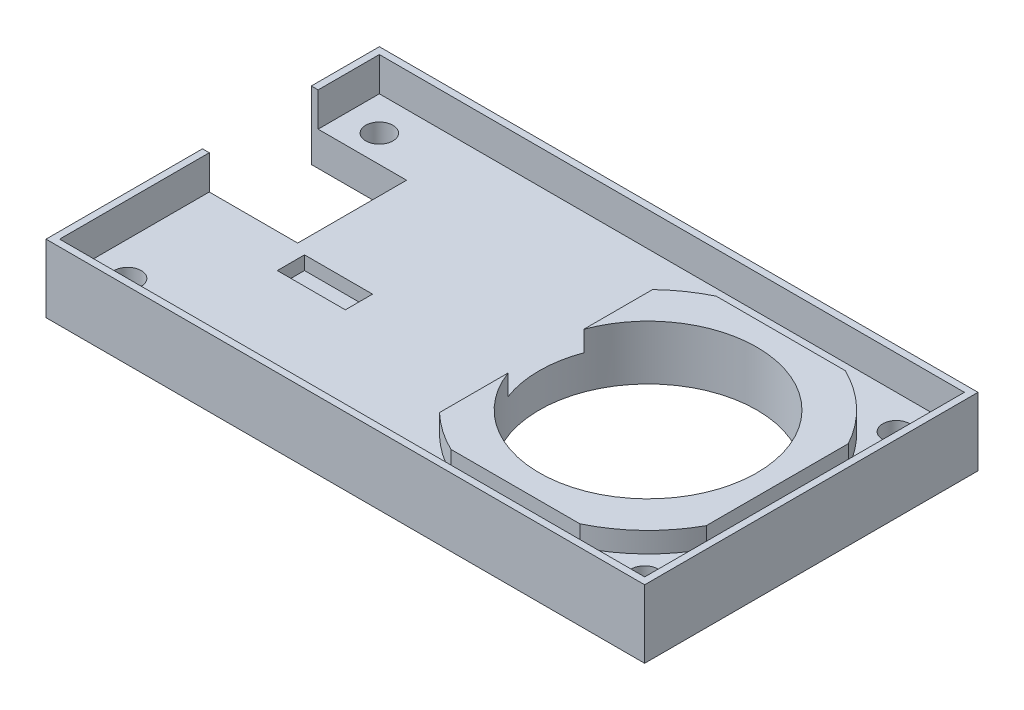
ISO-10303-21;
HEADER;
FILE_DESCRIPTION(('STEP AP214'),'2;1');
FILE_NAME('part.step','',(''),(''),'','','');
FILE_SCHEMA(('AUTOMOTIVE_DESIGN { 1 0 10303 214 1 1 1 1 }'));
ENDSEC;
DATA;
#1=APPLICATION_CONTEXT('core data for automotive mechanical design processes');
#2=APPLICATION_PROTOCOL_DEFINITION('international standard','automotive_design',2000,#1);
#3=PRODUCT_CONTEXT('',#1,'mechanical');
#4=PRODUCT('Part','Part','',(#3));
#5=PRODUCT_RELATED_PRODUCT_CATEGORY('part','',(#4));
#6=PRODUCT_DEFINITION_FORMATION('','',#4);
#7=PRODUCT_DEFINITION_CONTEXT('part definition',#1,'design');
#8=PRODUCT_DEFINITION('design','',#6,#7);
#9=PRODUCT_DEFINITION_SHAPE('','',#8);
#10=(LENGTH_UNIT() NAMED_UNIT(*) SI_UNIT(.MILLI.,.METRE.));
#11=(NAMED_UNIT(*) PLANE_ANGLE_UNIT() SI_UNIT($,.RADIAN.));
#12=(NAMED_UNIT(*) SI_UNIT($,.STERADIAN.) SOLID_ANGLE_UNIT());
#13=UNCERTAINTY_MEASURE_WITH_UNIT(LENGTH_MEASURE(1.E-05),#10,'distance_accuracy_value','');
#14=(GEOMETRIC_REPRESENTATION_CONTEXT(3) GLOBAL_UNCERTAINTY_ASSIGNED_CONTEXT((#13)) GLOBAL_UNIT_ASSIGNED_CONTEXT((#10,
#11,#12)) REPRESENTATION_CONTEXT('',''));
#15=CARTESIAN_POINT('',(0.,0.,0.));
#16=DIRECTION('',(0.,0.,1.));
#17=DIRECTION('',(1.,0.,0.));
#18=AXIS2_PLACEMENT_3D('',#15,#16,#17);
#19=CARTESIAN_POINT('',(64.,8.,-24.5));
#20=DIRECTION('',(0.,-1.,0.));
#21=DIRECTION('',(0.,0.,-1.));
#22=AXIS2_PLACEMENT_3D('',#19,#20,#21);
#23=CYLINDRICAL_SURFACE('',#22,21.6822351075379);
#24=CARTESIAN_POINT('',(64.,8.,-24.5));
#25=DIRECTION('',(0.,1.,0.));
#26=DIRECTION('',(0.,0.,1.));
#27=AXIS2_PLACEMENT_3D('',#24,#25,#26);
#28=CIRCLE('',#27,21.6822351075379);
#29=CARTESIAN_POINT('',(73.4799429986972,8.,-5.));
#30=VERTEX_POINT('',#29);
#31=CARTESIAN_POINT('',(83.,8.,-14.0539806979621));
#32=VERTEX_POINT('',#31);
#33=EDGE_CURVE('E394',#30,#32,#28,.T.);
#34=ORIENTED_EDGE('',*,*,#33,.F.);
#35=DIRECTION('',(0.,-1.,0.));
#36=VECTOR('',#35,1.);
#37=CARTESIAN_POINT('',(73.4799429986972,8.,-5.));
#38=LINE('',#37,#36);
#39=CARTESIAN_POINT('',(73.4799429986972,5.,-5.));
#40=VERTEX_POINT('',#39);
#41=EDGE_CURVE('E11',#30,#40,#38,.T.);
#42=ORIENTED_EDGE('',*,*,#41,.T.);
#43=CARTESIAN_POINT('',(64.,5.,-24.5));
#44=DIRECTION('',(0.,-1.,0.));
#45=DIRECTION('',(0.,0.,-1.));
#46=AXIS2_PLACEMENT_3D('',#43,#44,#45);
#47=CIRCLE('',#46,21.6822351075379);
#48=CARTESIAN_POINT('',(83.,5.,-14.0539806979621));
#49=VERTEX_POINT('',#48);
#50=EDGE_CURVE('E236',#40,#49,#47,.F.);
#51=ORIENTED_EDGE('',*,*,#50,.T.);
#52=DIRECTION('',(0.,-1.,0.));
#53=VECTOR('',#52,1.);
#54=CARTESIAN_POINT('',(83.,8.,-14.0539806979621));
#55=LINE('',#54,#53);
#56=EDGE_CURVE('E454',#49,#32,#55,.F.);
#57=ORIENTED_EDGE('',*,*,#56,.T.);
#58=EDGE_LOOP('',(#34,#42,#51,#57));
#59=FACE_BOUND('',#58,.T.);
#60=ADVANCED_FACE('F33',(#59),#23,.T.);
#61=CARTESIAN_POINT('',(54.5200570013027,8.,-44.));
#62=VERTEX_POINT('',#61);
#63=CARTESIAN_POINT('',(49.,8.,-40.1562868924451));
#64=VERTEX_POINT('',#63);
#65=EDGE_CURVE('E395',#62,#64,#28,.T.);
#66=ORIENTED_EDGE('',*,*,#65,.F.);
#67=DIRECTION('',(0.,-1.,0.));
#68=VECTOR('',#67,1.);
#69=CARTESIAN_POINT('',(54.5200570013027,8.,-44.));
#70=LINE('',#69,#68);
#71=CARTESIAN_POINT('',(54.5200570013027,5.,-44.));
#72=VERTEX_POINT('',#71);
#73=EDGE_CURVE('E226',#62,#72,#70,.T.);
#74=ORIENTED_EDGE('',*,*,#73,.T.);
#75=CARTESIAN_POINT('',(49.,5.,-40.1562868924451));
#76=VERTEX_POINT('',#75);
#77=EDGE_CURVE('E243',#72,#76,#47,.F.);
#78=ORIENTED_EDGE('',*,*,#77,.T.);
#79=DIRECTION('',(0.,-1.,0.));
#80=VECTOR('',#79,1.);
#81=CARTESIAN_POINT('',(49.,8.,-40.1562868924451));
#82=LINE('',#81,#80);
#83=EDGE_CURVE('E244',#64,#76,#82,.T.);
#84=ORIENTED_EDGE('',*,*,#83,.F.);
#85=EDGE_LOOP('',(#66,#74,#78,#84));
#86=FACE_BOUND('',#85,.T.);
#87=ADVANCED_FACE('F449',(#86),#23,.T.);
#88=CARTESIAN_POINT('',(83.,5.,-34.9460193020379));
#89=VERTEX_POINT('',#88);
#90=CARTESIAN_POINT('',(73.4799429986973,5.,-44.));
#91=VERTEX_POINT('',#90);
#92=EDGE_CURVE('E246',#89,#91,#47,.F.);
#93=ORIENTED_EDGE('',*,*,#92,.T.);
#94=DIRECTION('',(0.,-1.,0.));
#95=VECTOR('',#94,1.);
#96=CARTESIAN_POINT('',(73.4799429986973,8.,-44.));
#97=LINE('',#96,#95);
#98=CARTESIAN_POINT('',(73.4799429986973,8.,-44.));
#99=VERTEX_POINT('',#98);
#100=EDGE_CURVE('E458',#91,#99,#97,.F.);
#101=ORIENTED_EDGE('',*,*,#100,.T.);
#102=CARTESIAN_POINT('',(83.,8.,-34.9460193020379));
#103=VERTEX_POINT('',#102);
#104=EDGE_CURVE('E448',#103,#99,#28,.T.);
#105=ORIENTED_EDGE('',*,*,#104,.F.);
#106=DIRECTION('',(0.,-1.,0.));
#107=VECTOR('',#106,1.);
#108=CARTESIAN_POINT('',(83.,8.,-34.9460193020379));
#109=LINE('',#108,#107);
#110=EDGE_CURVE('E455',#103,#89,#109,.T.);
#111=ORIENTED_EDGE('',*,*,#110,.T.);
#112=EDGE_LOOP('',(#93,#101,#105,#111));
#113=FACE_BOUND('',#112,.T.);
#114=ADVANCED_FACE('F464',(#113),#23,.T.);
#115=CARTESIAN_POINT('',(0.,5.,0.));
#116=DIRECTION('',(0.,-1.,0.));
#117=DIRECTION('',(0.,0.,-1.));
#118=AXIS2_PLACEMENT_3D('',#115,#116,#117);
#119=PLANE('',#118);
#120=DIRECTION('',(1.,0.,0.));
#121=VECTOR('',#120,1.);
#122=CARTESIAN_POINT('',(83.,5.,-5.));
#123=LINE('',#122,#121);
#124=CARTESIAN_POINT('',(54.5200570013028,5.,-5.));
#125=VERTEX_POINT('',#124);
#126=EDGE_CURVE('E219',#125,#40,#123,.T.);
#127=ORIENTED_EDGE('',*,*,#126,.F.);
#128=CARTESIAN_POINT('',(49.,5.,-8.84371310755488));
#129=VERTEX_POINT('',#128);
#130=EDGE_CURVE('E233',#129,#125,#47,.F.);
#131=ORIENTED_EDGE('',*,*,#130,.F.);
#132=DIRECTION('',(0.,0.,-1.));
#133=VECTOR('',#132,1.);
#134=CARTESIAN_POINT('',(49.,5.,-7.54407288935077));
#135=LINE('',#134,#133);
#136=CARTESIAN_POINT('',(49.,5.,-18.93223563717));
#137=VERTEX_POINT('',#136);
#138=EDGE_CURVE('E409',#129,#137,#135,.T.);
#139=ORIENTED_EDGE('',*,*,#138,.T.);
#140=CARTESIAN_POINT('',(64.,5.,-24.5));
#141=DIRECTION('',(0.,-1.,0.));
#142=DIRECTION('',(0.,0.,-1.));
#143=AXIS2_PLACEMENT_3D('',#140,#141,#142);
#144=CIRCLE('',#143,16.);
#145=CARTESIAN_POINT('',(49.,5.,-30.06776436283));
#146=VERTEX_POINT('',#145);
#147=EDGE_CURVE('E404',#146,#137,#144,.F.);
#148=ORIENTED_EDGE('',*,*,#147,.F.);
#149=EDGE_CURVE('E407',#146,#76,#135,.T.);
#150=ORIENTED_EDGE('',*,*,#149,.T.);
#151=ORIENTED_EDGE('',*,*,#77,.F.);
#152=DIRECTION('',(-1.,0.,0.));
#153=VECTOR('',#152,1.);
#154=CARTESIAN_POINT('',(83.,5.,-44.));
#155=LINE('',#154,#153);
#156=EDGE_CURVE('E237',#91,#72,#155,.T.);
#157=ORIENTED_EDGE('',*,*,#156,.F.);
#158=ORIENTED_EDGE('',*,*,#92,.F.);
#159=DIRECTION('',(0.,0.,-1.));
#160=VECTOR('',#159,1.);
#161=CARTESIAN_POINT('',(83.,5.,-44.));
#162=LINE('',#161,#160);
#163=EDGE_CURVE('E439',#49,#89,#162,.T.);
#164=ORIENTED_EDGE('',*,*,#163,.F.);
#165=ORIENTED_EDGE('',*,*,#50,.F.);
#166=EDGE_LOOP('',(#127,#131,#139,#148,#150,#151,#157,#158,#164,#165));
#167=FACE_BOUND('',#166,.T.);
#168=CARTESIAN_POINT('',(82.,5.,-5.99999999999999));
#169=DIRECTION('',(0.,-1.,0.));
#170=DIRECTION('',(0.,0.,-1.));
#171=AXIS2_PLACEMENT_3D('',#168,#169,#170);
#172=CIRCLE('',#171,2.);
#173=CARTESIAN_POINT('',(82.,5.,-7.99999999999998));
#174=VERTEX_POINT('',#173);
#175=EDGE_CURVE('E430',#174,#174,#172,.F.);
#176=ORIENTED_EDGE('',*,*,#175,.F.);
#177=EDGE_LOOP('',(#176));
#178=FACE_BOUND('',#177,.T.);
#179=CARTESIAN_POINT('',(82.,5.,-43.));
#180=DIRECTION('',(0.,-1.,0.));
#181=DIRECTION('',(0.,0.,-1.));
#182=AXIS2_PLACEMENT_3D('',#179,#180,#181);
#183=CIRCLE('',#182,2.);
#184=CARTESIAN_POINT('',(82.,5.,-45.));
#185=VERTEX_POINT('',#184);
#186=EDGE_CURVE('E410',#185,#185,#183,.T.);
#187=ORIENTED_EDGE('',*,*,#186,.T.);
#188=EDGE_LOOP('',(#187));
#189=FACE_BOUND('',#188,.T.);
#190=DIRECTION('',(-1.,0.,0.));
#191=VECTOR('',#190,1.);
#192=CARTESIAN_POINT('',(1.,5.,-48.));
#193=LINE('',#192,#191);
#194=CARTESIAN_POINT('',(87.,5.,-48.));
#195=VERTEX_POINT('',#194);
#196=CARTESIAN_POINT('',(1.,5.,-48.));
#197=VERTEX_POINT('',#196);
#198=EDGE_CURVE('E312',#195,#197,#193,.T.);
#199=ORIENTED_EDGE('',*,*,#198,.T.);
#200=DIRECTION('',(0.,0.,1.));
#201=VECTOR('',#200,1.);
#202=CARTESIAN_POINT('',(1.,5.,-1.));
#203=LINE('',#202,#201);
#204=CARTESIAN_POINT('',(1.,5.,-39.));
#205=VERTEX_POINT('',#204);
#206=EDGE_CURVE('E320',#197,#205,#203,.T.);
#207=ORIENTED_EDGE('',*,*,#206,.T.);
#208=DIRECTION('',(1.,0.,0.));
#209=VECTOR('',#208,1.);
#210=CARTESIAN_POINT('',(0.,5.,-39.));
#211=LINE('',#210,#209);
#212=CARTESIAN_POINT('',(14.,5.,-39.));
#213=VERTEX_POINT('',#212);
#214=EDGE_CURVE('E248',#205,#213,#211,.T.);
#215=ORIENTED_EDGE('',*,*,#214,.T.);
#216=DIRECTION('',(0.,0.,1.));
#217=VECTOR('',#216,1.);
#218=CARTESIAN_POINT('',(14.,5.,0.));
#219=LINE('',#218,#217);
#220=CARTESIAN_POINT('',(14.,5.,-23.));
#221=VERTEX_POINT('',#220);
#222=EDGE_CURVE('E256',#213,#221,#219,.T.);
#223=ORIENTED_EDGE('',*,*,#222,.T.);
#224=DIRECTION('',(-1.,0.,0.));
#225=VECTOR('',#224,1.);
#226=CARTESIAN_POINT('',(0.,5.,-23.));
#227=LINE('',#226,#225);
#228=CARTESIAN_POINT('',(1.,5.,-23.));
#229=VERTEX_POINT('',#228);
#230=EDGE_CURVE('E260',#221,#229,#227,.T.);
#231=ORIENTED_EDGE('',*,*,#230,.T.);
#232=CARTESIAN_POINT('',(1.,5.,-1.));
#233=VERTEX_POINT('',#232);
#234=EDGE_CURVE('E322',#229,#233,#203,.T.);
#235=ORIENTED_EDGE('',*,*,#234,.T.);
#236=DIRECTION('',(1.,0.,0.));
#237=VECTOR('',#236,1.);
#238=CARTESIAN_POINT('',(1.,5.,-1.));
#239=LINE('',#238,#237);
#240=CARTESIAN_POINT('',(87.,5.,-1.));
#241=VERTEX_POINT('',#240);
#242=EDGE_CURVE('E318',#233,#241,#239,.T.);
#243=ORIENTED_EDGE('',*,*,#242,.T.);
#244=DIRECTION('',(0.,0.,-1.));
#245=VECTOR('',#244,1.);
#246=CARTESIAN_POINT('',(87.,5.,-1.));
#247=LINE('',#246,#245);
#248=EDGE_CURVE('E315',#241,#195,#247,.T.);
#249=ORIENTED_EDGE('',*,*,#248,.T.);
#250=EDGE_LOOP('',(#199,#207,#215,#223,#231,#235,#243,#249));
#251=FACE_BOUND('',#250,.T.);
#252=DIRECTION('',(-1.,0.,0.));
#253=VECTOR('',#252,1.);
#254=CARTESIAN_POINT('',(26.,5.,-22.));
#255=LINE('',#254,#253);
#256=CARTESIAN_POINT('',(26.,5.,-22.));
#257=VERTEX_POINT('',#256);
#258=CARTESIAN_POINT('',(16.,5.,-22.));
#259=VERTEX_POINT('',#258);
#260=EDGE_CURVE('E377',#257,#259,#255,.T.);
#261=ORIENTED_EDGE('',*,*,#260,.F.);
#262=DIRECTION('',(0.,0.,-1.));
#263=VECTOR('',#262,1.);
#264=CARTESIAN_POINT('',(26.,5.,-22.));
#265=LINE('',#264,#263);
#266=CARTESIAN_POINT('',(26.,5.,-18.));
#267=VERTEX_POINT('',#266);
#268=EDGE_CURVE('E380',#267,#257,#265,.T.);
#269=ORIENTED_EDGE('',*,*,#268,.F.);
#270=DIRECTION('',(1.,0.,0.));
#271=VECTOR('',#270,1.);
#272=CARTESIAN_POINT('',(26.,5.,-18.));
#273=LINE('',#272,#271);
#274=CARTESIAN_POINT('',(16.,5.,-18.));
#275=VERTEX_POINT('',#274);
#276=EDGE_CURVE('E370',#275,#267,#273,.T.);
#277=ORIENTED_EDGE('',*,*,#276,.F.);
#278=DIRECTION('',(0.,0.,1.));
#279=VECTOR('',#278,1.);
#280=CARTESIAN_POINT('',(16.,5.,-22.));
#281=LINE('',#280,#279);
#282=EDGE_CURVE('E374',#259,#275,#281,.T.);
#283=ORIENTED_EDGE('',*,*,#282,.F.);
#284=EDGE_LOOP('',(#261,#269,#277,#283));
#285=FACE_BOUND('',#284,.T.);
#286=CARTESIAN_POINT('',(6.00000000000001,5.,-6.));
#287=DIRECTION('',(0.,-1.,0.));
#288=DIRECTION('',(0.,0.,-1.));
#289=AXIS2_PLACEMENT_3D('',#286,#287,#288);
#290=CIRCLE('',#289,2.);
#291=CARTESIAN_POINT('',(6.00000000000001,5.,-8.));
#292=VERTEX_POINT('',#291);
#293=EDGE_CURVE('E424',#292,#292,#290,.T.);
#294=ORIENTED_EDGE('',*,*,#293,.T.);
#295=EDGE_LOOP('',(#294));
#296=FACE_BOUND('',#295,.T.);
#297=CARTESIAN_POINT('',(6.00000000000002,5.,-43.));
#298=DIRECTION('',(0.,-1.,0.));
#299=DIRECTION('',(0.,0.,-1.));
#300=AXIS2_PLACEMENT_3D('',#297,#298,#299);
#301=CIRCLE('',#300,2.);
#302=CARTESIAN_POINT('',(6.00000000000002,5.,-45.));
#303=VERTEX_POINT('',#302);
#304=EDGE_CURVE('E423',#303,#303,#301,.F.);
#305=ORIENTED_EDGE('',*,*,#304,.F.);
#306=EDGE_LOOP('',(#305));
#307=FACE_BOUND('',#306,.T.);
#308=ADVANCED_FACE('F230',(#167,#178,#189,#251,#285,#296,#307),#119,.F.);
#309=CARTESIAN_POINT('',(0.,0.,0.));
#310=DIRECTION('',(0.,-1.,0.));
#311=DIRECTION('',(0.,0.,-1.));
#312=AXIS2_PLACEMENT_3D('',#309,#310,#311);
#313=PLANE('',#312);
#314=CARTESIAN_POINT('',(6.00000000000001,0.,-6.));
#315=DIRECTION('',(0.,1.,0.));
#316=DIRECTION('',(0.,0.,1.));
#317=AXIS2_PLACEMENT_3D('',#314,#315,#316);
#318=CIRCLE('',#317,2.);
#319=CARTESIAN_POINT('',(6.00000000000001,0.,-4.));
#320=VERTEX_POINT('',#319);
#321=EDGE_CURVE('E420',#320,#320,#318,.T.);
#322=ORIENTED_EDGE('',*,*,#321,.T.);
#323=EDGE_LOOP('',(#322));
#324=FACE_BOUND('',#323,.T.);
#325=CARTESIAN_POINT('',(82.,0.,-43.));
#326=DIRECTION('',(0.,1.,0.));
#327=DIRECTION('',(0.,0.,1.));
#328=AXIS2_PLACEMENT_3D('',#325,#326,#327);
#329=CIRCLE('',#328,2.);
#330=CARTESIAN_POINT('',(82.,0.,-41.));
#331=VERTEX_POINT('',#330);
#332=EDGE_CURVE('E416',#331,#331,#329,.T.);
#333=ORIENTED_EDGE('',*,*,#332,.T.);
#334=EDGE_LOOP('',(#333));
#335=FACE_BOUND('',#334,.T.);
#336=DIRECTION('',(1.,0.,0.));
#337=VECTOR('',#336,1.);
#338=CARTESIAN_POINT('',(14.,0.,-39.));
#339=LINE('',#338,#337);
#340=CARTESIAN_POINT('',(0.,0.,-39.));
#341=VERTEX_POINT('',#340);
#342=CARTESIAN_POINT('',(14.,0.,-39.));
#343=VERTEX_POINT('',#342);
#344=EDGE_CURVE('E345',#341,#343,#339,.T.);
#345=ORIENTED_EDGE('',*,*,#344,.F.);
#346=DIRECTION('',(0.,0.,1.));
#347=VECTOR('',#346,1.);
#348=CARTESIAN_POINT('',(0.,0.,0.));
#349=LINE('',#348,#347);
#350=CARTESIAN_POINT('',(0.,0.,-49.));
#351=VERTEX_POINT('',#350);
#352=EDGE_CURVE('E283',#351,#341,#349,.T.);
#353=ORIENTED_EDGE('',*,*,#352,.F.);
#354=DIRECTION('',(-1.,0.,0.));
#355=VECTOR('',#354,1.);
#356=CARTESIAN_POINT('',(0.,0.,-49.));
#357=LINE('',#356,#355);
#358=CARTESIAN_POINT('',(88.,0.,-49.));
#359=VERTEX_POINT('',#358);
#360=EDGE_CURVE('E277',#359,#351,#357,.T.);
#361=ORIENTED_EDGE('',*,*,#360,.F.);
#362=DIRECTION('',(0.,0.,-1.));
#363=VECTOR('',#362,1.);
#364=CARTESIAN_POINT('',(88.,0.,0.));
#365=LINE('',#364,#363);
#366=CARTESIAN_POINT('',(88.,0.,0.));
#367=VERTEX_POINT('',#366);
#368=EDGE_CURVE('E279',#367,#359,#365,.T.);
#369=ORIENTED_EDGE('',*,*,#368,.F.);
#370=DIRECTION('',(1.,0.,0.));
#371=VECTOR('',#370,1.);
#372=CARTESIAN_POINT('',(0.,0.,0.));
#373=LINE('',#372,#371);
#374=CARTESIAN_POINT('',(0.,0.,0.));
#375=VERTEX_POINT('',#374);
#376=EDGE_CURVE('E281',#375,#367,#373,.T.);
#377=ORIENTED_EDGE('',*,*,#376,.F.);
#378=CARTESIAN_POINT('',(0.,0.,-23.));
#379=VERTEX_POINT('',#378);
#380=EDGE_CURVE('E286',#379,#375,#349,.T.);
#381=ORIENTED_EDGE('',*,*,#380,.F.);
#382=DIRECTION('',(-1.,0.,0.));
#383=VECTOR('',#382,1.);
#384=CARTESIAN_POINT('',(14.,0.,-23.));
#385=LINE('',#384,#383);
#386=CARTESIAN_POINT('',(14.,0.,-23.));
#387=VERTEX_POINT('',#386);
#388=EDGE_CURVE('E354',#387,#379,#385,.T.);
#389=ORIENTED_EDGE('',*,*,#388,.F.);
#390=DIRECTION('',(0.,0.,1.));
#391=VECTOR('',#390,1.);
#392=CARTESIAN_POINT('',(14.,0.,-23.));
#393=LINE('',#392,#391);
#394=EDGE_CURVE('E356',#343,#387,#393,.T.);
#395=ORIENTED_EDGE('',*,*,#394,.F.);
#396=EDGE_LOOP('',(#345,#353,#361,#369,#377,#381,#389,#395));
#397=FACE_BOUND('',#396,.T.);
#398=CARTESIAN_POINT('',(64.,0.,-24.5));
#399=DIRECTION('',(0.,-1.,0.));
#400=DIRECTION('',(0.,0.,-1.));
#401=AXIS2_PLACEMENT_3D('',#398,#399,#400);
#402=CIRCLE('',#401,16.);
#403=CARTESIAN_POINT('',(64.,0.,-40.5));
#404=VERTEX_POINT('',#403);
#405=EDGE_CURVE('E332',#404,#404,#402,.T.);
#406=ORIENTED_EDGE('',*,*,#405,.F.);
#407=EDGE_LOOP('',(#406));
#408=FACE_BOUND('',#407,.T.);
#409=CARTESIAN_POINT('',(6.00000000000002,0.,-43.));
#410=DIRECTION('',(0.,-1.,0.));
#411=DIRECTION('',(0.,0.,-1.));
#412=AXIS2_PLACEMENT_3D('',#409,#410,#411);
#413=CIRCLE('',#412,2.);
#414=CARTESIAN_POINT('',(6.00000000000002,0.,-45.));
#415=VERTEX_POINT('',#414);
#416=EDGE_CURVE('E427',#415,#415,#413,.T.);
#417=ORIENTED_EDGE('',*,*,#416,.F.);
#418=EDGE_LOOP('',(#417));
#419=FACE_BOUND('',#418,.T.);
#420=CARTESIAN_POINT('',(82.,0.,-5.99999999999999));
#421=DIRECTION('',(0.,-1.,0.));
#422=DIRECTION('',(0.,0.,-1.));
#423=AXIS2_PLACEMENT_3D('',#420,#421,#422);
#424=CIRCLE('',#423,2.);
#425=CARTESIAN_POINT('',(82.,0.,-7.99999999999998));
#426=VERTEX_POINT('',#425);
#427=EDGE_CURVE('E419',#426,#426,#424,.T.);
#428=ORIENTED_EDGE('',*,*,#427,.F.);
#429=EDGE_LOOP('',(#428));
#430=FACE_BOUND('',#429,.T.);
#431=ADVANCED_FACE('F509',(#324,#335,#397,#408,#419,#430),#313,.T.);
#432=CARTESIAN_POINT('',(64.,5.,-24.5));
#433=DIRECTION('',(0.,-1.,0.));
#434=DIRECTION('',(0.,0.,-1.));
#435=AXIS2_PLACEMENT_3D('',#432,#433,#434);
#436=CYLINDRICAL_SURFACE('',#435,16.);
#437=ORIENTED_EDGE('',*,*,#405,.T.);
#438=EDGE_LOOP('',(#437));
#439=FACE_BOUND('',#438,.T.);
#440=DIRECTION('',(0.,-1.,0.));
#441=VECTOR('',#440,1.);
#442=CARTESIAN_POINT('',(49.,5.,-30.06776436283));
#443=LINE('',#442,#441);
#444=CARTESIAN_POINT('',(49.,8.,-30.0677643628301));
#445=VERTEX_POINT('',#444);
#446=EDGE_CURVE('E399',#146,#445,#443,.F.);
#447=ORIENTED_EDGE('',*,*,#446,.F.);
#448=ORIENTED_EDGE('',*,*,#147,.T.);
#449=DIRECTION('',(0.,-1.,0.));
#450=VECTOR('',#449,1.);
#451=CARTESIAN_POINT('',(49.,5.,-18.93223563717));
#452=LINE('',#451,#450);
#453=CARTESIAN_POINT('',(49.,8.,-18.9322356371699));
#454=VERTEX_POINT('',#453);
#455=EDGE_CURVE('E401',#454,#137,#452,.T.);
#456=ORIENTED_EDGE('',*,*,#455,.F.);
#457=CARTESIAN_POINT('',(64.,8.,-24.5));
#458=DIRECTION('',(0.,1.,0.));
#459=DIRECTION('',(0.,0.,1.));
#460=AXIS2_PLACEMENT_3D('',#457,#458,#459);
#461=CIRCLE('',#460,16.);
#462=EDGE_CURVE('E396',#454,#445,#461,.T.);
#463=ORIENTED_EDGE('',*,*,#462,.T.);
#464=EDGE_LOOP('',(#447,#448,#456,#463));
#465=FACE_BOUND('',#464,.T.);
#466=ADVANCED_FACE('F476',(#439,#465),#436,.F.);
#467=CARTESIAN_POINT('',(64.,8.,-24.5));
#468=DIRECTION('',(0.,1.,0.));
#469=DIRECTION('',(0.,0.,1.));
#470=AXIS2_PLACEMENT_3D('',#467,#468,#469);
#471=PLANE('',#470);
#472=DIRECTION('',(1.,0.,0.));
#473=VECTOR('',#472,1.);
#474=CARTESIAN_POINT('',(83.,8.,-5.));
#475=LINE('',#474,#473);
#476=CARTESIAN_POINT('',(54.5200570013028,8.,-5.));
#477=VERTEX_POINT('',#476);
#478=EDGE_CURVE('E221',#477,#30,#475,.T.);
#479=ORIENTED_EDGE('',*,*,#478,.T.);
#480=ORIENTED_EDGE('',*,*,#33,.T.);
#481=DIRECTION('',(0.,0.,-1.));
#482=VECTOR('',#481,1.);
#483=CARTESIAN_POINT('',(83.,8.,-44.));
#484=LINE('',#483,#482);
#485=EDGE_CURVE('E56',#32,#103,#484,.T.);
#486=ORIENTED_EDGE('',*,*,#485,.T.);
#487=ORIENTED_EDGE('',*,*,#104,.T.);
#488=DIRECTION('',(-1.,0.,0.));
#489=VECTOR('',#488,1.);
#490=CARTESIAN_POINT('',(83.,8.,-44.));
#491=LINE('',#490,#489);
#492=EDGE_CURVE('E48',#99,#62,#491,.T.);
#493=ORIENTED_EDGE('',*,*,#492,.T.);
#494=ORIENTED_EDGE('',*,*,#65,.T.);
#495=DIRECTION('',(0.,0.,-1.));
#496=VECTOR('',#495,1.);
#497=CARTESIAN_POINT('',(49.,8.,-7.54407288935077));
#498=LINE('',#497,#496);
#499=EDGE_CURVE('E411',#445,#64,#498,.T.);
#500=ORIENTED_EDGE('',*,*,#499,.F.);
#501=ORIENTED_EDGE('',*,*,#462,.F.);
#502=CARTESIAN_POINT('',(49.,8.,-8.84371310755488));
#503=VERTEX_POINT('',#502);
#504=EDGE_CURVE('E406',#503,#454,#498,.T.);
#505=ORIENTED_EDGE('',*,*,#504,.F.);
#506=EDGE_CURVE('E382',#503,#477,#28,.T.);
#507=ORIENTED_EDGE('',*,*,#506,.T.);
#508=EDGE_LOOP('',(#479,#480,#486,#487,#493,#494,#500,#501,#505,#507));
#509=FACE_BOUND('',#508,.T.);
#510=ADVANCED_FACE('F445',(#509),#471,.T.);
#511=ORIENTED_EDGE('',*,*,#130,.T.);
#512=DIRECTION('',(0.,-1.,0.));
#513=VECTOR('',#512,1.);
#514=CARTESIAN_POINT('',(54.5200570013028,8.,-5.));
#515=LINE('',#514,#513);
#516=EDGE_CURVE('E41',#125,#477,#515,.F.);
#517=ORIENTED_EDGE('',*,*,#516,.T.);
#518=ORIENTED_EDGE('',*,*,#506,.F.);
#519=DIRECTION('',(0.,-1.,0.));
#520=VECTOR('',#519,1.);
#521=CARTESIAN_POINT('',(49.,8.,-8.84371310755488));
#522=LINE('',#521,#520);
#523=EDGE_CURVE('E241',#129,#503,#522,.F.);
#524=ORIENTED_EDGE('',*,*,#523,.F.);
#525=EDGE_LOOP('',(#511,#517,#518,#524));
#526=FACE_BOUND('',#525,.T.);
#527=ADVANCED_FACE('F240',(#526),#23,.T.);
#528=CARTESIAN_POINT('',(0.,5.,0.));
#529=DIRECTION('',(1.,0.,0.));
#530=DIRECTION('',(0.,0.,-1.));
#531=AXIS2_PLACEMENT_3D('',#528,#529,#530);
#532=PLANE('',#531);
#533=ORIENTED_EDGE('',*,*,#352,.T.);
#534=DIRECTION('',(0.,-1.,0.));
#535=VECTOR('',#534,1.);
#536=CARTESIAN_POINT('',(0.,31.2602916254693,-39.));
#537=LINE('',#536,#535);
#538=CARTESIAN_POINT('',(0.,10.,-39.));
#539=VERTEX_POINT('',#538);
#540=EDGE_CURVE('E348',#539,#341,#537,.T.);
#541=ORIENTED_EDGE('',*,*,#540,.F.);
#542=DIRECTION('',(0.,0.,1.));
#543=VECTOR('',#542,1.);
#544=CARTESIAN_POINT('',(0.,10.,0.));
#545=LINE('',#544,#543);
#546=CARTESIAN_POINT('',(0.,10.,-49.));
#547=VERTEX_POINT('',#546);
#548=EDGE_CURVE('E296',#547,#539,#545,.T.);
#549=ORIENTED_EDGE('',*,*,#548,.F.);
#550=DIRECTION('',(0.,-1.,0.));
#551=VECTOR('',#550,1.);
#552=CARTESIAN_POINT('',(0.,5.,-49.));
#553=LINE('',#552,#551);
#554=EDGE_CURVE('E274',#547,#351,#553,.T.);
#555=ORIENTED_EDGE('',*,*,#554,.T.);
#556=EDGE_LOOP('',(#533,#541,#549,#555));
#557=FACE_BOUND('',#556,.T.);
#558=ADVANCED_FACE('F498',(#557),#532,.F.);
#559=CARTESIAN_POINT('',(1.,10.,-1.));
#560=DIRECTION('',(1.,0.,0.));
#561=DIRECTION('',(0.,0.,-1.));
#562=AXIS2_PLACEMENT_3D('',#559,#560,#561);
#563=PLANE('',#562);
#564=DIRECTION('',(0.,1.,0.));
#565=VECTOR('',#564,1.);
#566=CARTESIAN_POINT('',(1.,10.,-39.));
#567=LINE('',#566,#565);
#568=CARTESIAN_POINT('',(0.999999999999999,10.,-39.));
#569=VERTEX_POINT('',#568);
#570=EDGE_CURVE('E335',#205,#569,#567,.T.);
#571=ORIENTED_EDGE('',*,*,#570,.F.);
#572=ORIENTED_EDGE('',*,*,#206,.F.);
#573=DIRECTION('',(0.,-1.,0.));
#574=VECTOR('',#573,1.);
#575=CARTESIAN_POINT('',(1.,10.,-48.));
#576=LINE('',#575,#574);
#577=CARTESIAN_POINT('',(1.,10.,-48.));
#578=VERTEX_POINT('',#577);
#579=EDGE_CURVE('E308',#578,#197,#576,.T.);
#580=ORIENTED_EDGE('',*,*,#579,.F.);
#581=DIRECTION('',(0.,0.,1.));
#582=VECTOR('',#581,1.);
#583=CARTESIAN_POINT('',(1.,10.,-1.));
#584=LINE('',#583,#582);
#585=EDGE_CURVE('E329',#578,#569,#584,.T.);
#586=ORIENTED_EDGE('',*,*,#585,.T.);
#587=EDGE_LOOP('',(#571,#572,#580,#586));
#588=FACE_BOUND('',#587,.T.);
#589=ADVANCED_FACE('F503',(#588),#563,.T.);
#590=CARTESIAN_POINT('',(0.,10.,-23.));
#591=VERTEX_POINT('',#590);
#592=CARTESIAN_POINT('',(0.,10.,0.));
#593=VERTEX_POINT('',#592);
#594=EDGE_CURVE('E299',#591,#593,#545,.T.);
#595=ORIENTED_EDGE('',*,*,#594,.F.);
#596=DIRECTION('',(0.,-1.,0.));
#597=VECTOR('',#596,1.);
#598=CARTESIAN_POINT('',(0.,31.2602916254693,-23.));
#599=LINE('',#598,#597);
#600=EDGE_CURVE('E344',#591,#379,#599,.T.);
#601=ORIENTED_EDGE('',*,*,#600,.T.);
#602=ORIENTED_EDGE('',*,*,#380,.T.);
#603=DIRECTION('',(0.,-1.,0.));
#604=VECTOR('',#603,1.);
#605=CARTESIAN_POINT('',(0.,5.,0.));
#606=LINE('',#605,#604);
#607=EDGE_CURVE('E265',#593,#375,#606,.T.);
#608=ORIENTED_EDGE('',*,*,#607,.F.);
#609=EDGE_LOOP('',(#595,#601,#602,#608));
#610=FACE_BOUND('',#609,.T.);
#611=ADVANCED_FACE('F35',(#610),#532,.F.);
#612=CARTESIAN_POINT('',(0.,5.,0.));
#613=DIRECTION('',(0.,0.,-1.));
#614=DIRECTION('',(-1.,0.,0.));
#615=AXIS2_PLACEMENT_3D('',#612,#613,#614);
#616=PLANE('',#615);
#617=ORIENTED_EDGE('',*,*,#376,.T.);
#618=DIRECTION('',(0.,-1.,0.));
#619=VECTOR('',#618,1.);
#620=CARTESIAN_POINT('',(88.,5.,0.));
#621=LINE('',#620,#619);
#622=CARTESIAN_POINT('',(88.,10.,0.));
#623=VERTEX_POINT('',#622);
#624=EDGE_CURVE('E268',#623,#367,#621,.T.);
#625=ORIENTED_EDGE('',*,*,#624,.F.);
#626=DIRECTION('',(1.,0.,0.));
#627=VECTOR('',#626,1.);
#628=CARTESIAN_POINT('',(0.,10.,0.));
#629=LINE('',#628,#627);
#630=EDGE_CURVE('E293',#593,#623,#629,.T.);
#631=ORIENTED_EDGE('',*,*,#630,.F.);
#632=ORIENTED_EDGE('',*,*,#607,.T.);
#633=EDGE_LOOP('',(#617,#625,#631,#632));
#634=FACE_BOUND('',#633,.T.);
#635=ADVANCED_FACE('F526',(#634),#616,.F.);
#636=CARTESIAN_POINT('',(88.,5.,0.));
#637=DIRECTION('',(-1.,0.,0.));
#638=DIRECTION('',(0.,0.,1.));
#639=AXIS2_PLACEMENT_3D('',#636,#637,#638);
#640=PLANE('',#639);
#641=ORIENTED_EDGE('',*,*,#368,.T.);
#642=DIRECTION('',(0.,-1.,0.));
#643=VECTOR('',#642,1.);
#644=CARTESIAN_POINT('',(88.,5.,-49.));
#645=LINE('',#644,#643);
#646=CARTESIAN_POINT('',(88.,10.,-49.));
#647=VERTEX_POINT('',#646);
#648=EDGE_CURVE('E271',#647,#359,#645,.T.);
#649=ORIENTED_EDGE('',*,*,#648,.F.);
#650=DIRECTION('',(0.,0.,-1.));
#651=VECTOR('',#650,1.);
#652=CARTESIAN_POINT('',(88.,10.,0.));
#653=LINE('',#652,#651);
#654=EDGE_CURVE('E290',#623,#647,#653,.T.);
#655=ORIENTED_EDGE('',*,*,#654,.F.);
#656=ORIENTED_EDGE('',*,*,#624,.T.);
#657=EDGE_LOOP('',(#641,#649,#655,#656));
#658=FACE_BOUND('',#657,.T.);
#659=ADVANCED_FACE('F523',(#658),#640,.F.);
#660=CARTESIAN_POINT('',(0.,5.,-49.));
#661=DIRECTION('',(0.,0.,1.));
#662=DIRECTION('',(1.,0.,0.));
#663=AXIS2_PLACEMENT_3D('',#660,#661,#662);
#664=PLANE('',#663);
#665=ORIENTED_EDGE('',*,*,#360,.T.);
#666=ORIENTED_EDGE('',*,*,#554,.F.);
#667=DIRECTION('',(-1.,0.,0.));
#668=VECTOR('',#667,1.);
#669=CARTESIAN_POINT('',(0.,10.,-49.));
#670=LINE('',#669,#668);
#671=EDGE_CURVE('E287',#647,#547,#670,.T.);
#672=ORIENTED_EDGE('',*,*,#671,.F.);
#673=ORIENTED_EDGE('',*,*,#648,.T.);
#674=EDGE_LOOP('',(#665,#666,#672,#673));
#675=FACE_BOUND('',#674,.T.);
#676=ADVANCED_FACE('F520',(#675),#664,.F.);
#677=CARTESIAN_POINT('',(0.,10.,0.));
#678=DIRECTION('',(0.,-1.,0.));
#679=DIRECTION('',(0.,0.,-1.));
#680=AXIS2_PLACEMENT_3D('',#677,#678,#679);
#681=PLANE('',#680);
#682=ORIENTED_EDGE('',*,*,#548,.T.);
#683=DIRECTION('',(-1.,0.,0.));
#684=VECTOR('',#683,1.);
#685=CARTESIAN_POINT('',(14.,10.,-39.));
#686=LINE('',#685,#684);
#687=EDGE_CURVE('E341',#569,#539,#686,.T.);
#688=ORIENTED_EDGE('',*,*,#687,.F.);
#689=ORIENTED_EDGE('',*,*,#585,.F.);
#690=DIRECTION('',(-1.,0.,0.));
#691=VECTOR('',#690,1.);
#692=CARTESIAN_POINT('',(1.,10.,-48.));
#693=LINE('',#692,#691);
#694=CARTESIAN_POINT('',(87.,10.,-48.));
#695=VERTEX_POINT('',#694);
#696=EDGE_CURVE('E311',#695,#578,#693,.T.);
#697=ORIENTED_EDGE('',*,*,#696,.F.);
#698=DIRECTION('',(0.,0.,-1.));
#699=VECTOR('',#698,1.);
#700=CARTESIAN_POINT('',(87.,10.,-1.));
#701=LINE('',#700,#699);
#702=CARTESIAN_POINT('',(87.,10.,-1.));
#703=VERTEX_POINT('',#702);
#704=EDGE_CURVE('E324',#703,#695,#701,.T.);
#705=ORIENTED_EDGE('',*,*,#704,.F.);
#706=DIRECTION('',(1.,0.,0.));
#707=VECTOR('',#706,1.);
#708=CARTESIAN_POINT('',(1.,10.,-1.));
#709=LINE('',#708,#707);
#710=CARTESIAN_POINT('',(1.,10.,-1.));
#711=VERTEX_POINT('',#710);
#712=EDGE_CURVE('E327',#711,#703,#709,.T.);
#713=ORIENTED_EDGE('',*,*,#712,.F.);
#714=CARTESIAN_POINT('',(1.,10.,-23.));
#715=VERTEX_POINT('',#714);
#716=EDGE_CURVE('E314',#715,#711,#584,.T.);
#717=ORIENTED_EDGE('',*,*,#716,.F.);
#718=DIRECTION('',(1.,0.,0.));
#719=VECTOR('',#718,1.);
#720=CARTESIAN_POINT('',(14.,10.,-23.));
#721=LINE('',#720,#719);
#722=EDGE_CURVE('E339',#591,#715,#721,.T.);
#723=ORIENTED_EDGE('',*,*,#722,.F.);
#724=ORIENTED_EDGE('',*,*,#594,.T.);
#725=ORIENTED_EDGE('',*,*,#630,.T.);
#726=ORIENTED_EDGE('',*,*,#654,.T.);
#727=ORIENTED_EDGE('',*,*,#671,.T.);
#728=EDGE_LOOP('',(#682,#688,#689,#697,#705,#713,#717,#723,#724,#725,#726,#727));
#729=FACE_BOUND('',#728,.T.);
#730=ADVANCED_FACE('F517',(#729),#681,.F.);
#731=DIRECTION('',(0.,-1.,0.));
#732=VECTOR('',#731,1.);
#733=CARTESIAN_POINT('',(1.,10.,-23.));
#734=LINE('',#733,#732);
#735=EDGE_CURVE('E337',#715,#229,#734,.T.);
#736=ORIENTED_EDGE('',*,*,#735,.F.);
#737=ORIENTED_EDGE('',*,*,#716,.T.);
#738=DIRECTION('',(0.,-1.,0.));
#739=VECTOR('',#738,1.);
#740=CARTESIAN_POINT('',(1.,10.,-1.));
#741=LINE('',#740,#739);
#742=EDGE_CURVE('E300',#711,#233,#741,.T.);
#743=ORIENTED_EDGE('',*,*,#742,.T.);
#744=ORIENTED_EDGE('',*,*,#234,.F.);
#745=EDGE_LOOP('',(#736,#737,#743,#744));
#746=FACE_BOUND('',#745,.T.);
#747=ADVANCED_FACE('F586',(#746),#563,.T.);
#748=CARTESIAN_POINT('',(1.,10.,-1.));
#749=DIRECTION('',(0.,0.,-1.));
#750=DIRECTION('',(-1.,0.,0.));
#751=AXIS2_PLACEMENT_3D('',#748,#749,#750);
#752=PLANE('',#751);
#753=DIRECTION('',(0.,-1.,0.));
#754=VECTOR('',#753,1.);
#755=CARTESIAN_POINT('',(87.,10.,-1.));
#756=LINE('',#755,#754);
#757=EDGE_CURVE('E303',#703,#241,#756,.T.);
#758=ORIENTED_EDGE('',*,*,#757,.T.);
#759=ORIENTED_EDGE('',*,*,#242,.F.);
#760=ORIENTED_EDGE('',*,*,#742,.F.);
#761=ORIENTED_EDGE('',*,*,#712,.T.);
#762=EDGE_LOOP('',(#758,#759,#760,#761));
#763=FACE_BOUND('',#762,.T.);
#764=ADVANCED_FACE('F581',(#763),#752,.T.);
#765=CARTESIAN_POINT('',(87.,10.,-1.));
#766=DIRECTION('',(-1.,0.,0.));
#767=DIRECTION('',(0.,0.,1.));
#768=AXIS2_PLACEMENT_3D('',#765,#766,#767);
#769=PLANE('',#768);
#770=DIRECTION('',(0.,-1.,0.));
#771=VECTOR('',#770,1.);
#772=CARTESIAN_POINT('',(87.,10.,-48.));
#773=LINE('',#772,#771);
#774=EDGE_CURVE('E306',#695,#195,#773,.T.);
#775=ORIENTED_EDGE('',*,*,#774,.T.);
#776=ORIENTED_EDGE('',*,*,#248,.F.);
#777=ORIENTED_EDGE('',*,*,#757,.F.);
#778=ORIENTED_EDGE('',*,*,#704,.T.);
#779=EDGE_LOOP('',(#775,#776,#777,#778));
#780=FACE_BOUND('',#779,.T.);
#781=ADVANCED_FACE('F578',(#780),#769,.T.);
#782=CARTESIAN_POINT('',(1.,10.,-48.));
#783=DIRECTION('',(0.,0.,1.));
#784=DIRECTION('',(1.,0.,0.));
#785=AXIS2_PLACEMENT_3D('',#782,#783,#784);
#786=PLANE('',#785);
#787=ORIENTED_EDGE('',*,*,#579,.T.);
#788=ORIENTED_EDGE('',*,*,#198,.F.);
#789=ORIENTED_EDGE('',*,*,#774,.F.);
#790=ORIENTED_EDGE('',*,*,#696,.T.);
#791=EDGE_LOOP('',(#787,#788,#789,#790));
#792=FACE_BOUND('',#791,.T.);
#793=ADVANCED_FACE('F572',(#792),#786,.T.);
#794=CARTESIAN_POINT('',(14.,31.2602916254693,-23.));
#795=DIRECTION('',(1.,0.,0.));
#796=DIRECTION('',(0.,0.,-1.));
#797=AXIS2_PLACEMENT_3D('',#794,#795,#796);
#798=PLANE('',#797);
#799=DIRECTION('',(0.,-1.,0.));
#800=VECTOR('',#799,1.);
#801=CARTESIAN_POINT('',(14.,31.2602916254693,-39.));
#802=LINE('',#801,#800);
#803=EDGE_CURVE('E350',#213,#343,#802,.T.);
#804=ORIENTED_EDGE('',*,*,#803,.T.);
#805=ORIENTED_EDGE('',*,*,#394,.T.);
#806=DIRECTION('',(0.,-1.,0.));
#807=VECTOR('',#806,1.);
#808=CARTESIAN_POINT('',(14.,31.2602916254693,-23.));
#809=LINE('',#808,#807);
#810=EDGE_CURVE('E342',#221,#387,#809,.T.);
#811=ORIENTED_EDGE('',*,*,#810,.F.);
#812=ORIENTED_EDGE('',*,*,#222,.F.);
#813=EDGE_LOOP('',(#804,#805,#811,#812));
#814=FACE_BOUND('',#813,.T.);
#815=ADVANCED_FACE('F560',(#814),#798,.F.);
#816=CARTESIAN_POINT('',(14.,31.2602916254693,-39.));
#817=DIRECTION('',(0.,0.,-1.));
#818=DIRECTION('',(-1.,0.,0.));
#819=AXIS2_PLACEMENT_3D('',#816,#817,#818);
#820=PLANE('',#819);
#821=ORIENTED_EDGE('',*,*,#570,.T.);
#822=ORIENTED_EDGE('',*,*,#687,.T.);
#823=ORIENTED_EDGE('',*,*,#540,.T.);
#824=ORIENTED_EDGE('',*,*,#344,.T.);
#825=ORIENTED_EDGE('',*,*,#803,.F.);
#826=ORIENTED_EDGE('',*,*,#214,.F.);
#827=EDGE_LOOP('',(#821,#822,#823,#824,#825,#826));
#828=FACE_BOUND('',#827,.T.);
#829=ADVANCED_FACE('F563',(#828),#820,.F.);
#830=CARTESIAN_POINT('',(14.,31.2602916254693,-23.));
#831=DIRECTION('',(0.,0.,1.));
#832=DIRECTION('',(1.,0.,0.));
#833=AXIS2_PLACEMENT_3D('',#830,#831,#832);
#834=PLANE('',#833);
#835=ORIENTED_EDGE('',*,*,#735,.T.);
#836=ORIENTED_EDGE('',*,*,#230,.F.);
#837=ORIENTED_EDGE('',*,*,#810,.T.);
#838=ORIENTED_EDGE('',*,*,#388,.T.);
#839=ORIENTED_EDGE('',*,*,#600,.F.);
#840=ORIENTED_EDGE('',*,*,#722,.T.);
#841=EDGE_LOOP('',(#835,#836,#837,#838,#839,#840));
#842=FACE_BOUND('',#841,.T.);
#843=ADVANCED_FACE('F557',(#842),#834,.F.);
#844=CARTESIAN_POINT('',(26.,3.,-22.));
#845=DIRECTION('',(1.,0.,0.));
#846=DIRECTION('',(0.,0.,-1.));
#847=AXIS2_PLACEMENT_3D('',#844,#845,#846);
#848=PLANE('',#847);
#849=ORIENTED_EDGE('',*,*,#268,.T.);
#850=DIRECTION('',(0.,1.,0.));
#851=VECTOR('',#850,1.);
#852=CARTESIAN_POINT('',(26.,3.,-22.));
#853=LINE('',#852,#851);
#854=CARTESIAN_POINT('',(26.,3.,-22.));
#855=VERTEX_POINT('',#854);
#856=EDGE_CURVE('E361',#855,#257,#853,.T.);
#857=ORIENTED_EDGE('',*,*,#856,.F.);
#858=DIRECTION('',(0.,0.,-1.));
#859=VECTOR('',#858,1.);
#860=CARTESIAN_POINT('',(26.,3.,-22.));
#861=LINE('',#860,#859);
#862=CARTESIAN_POINT('',(26.,3.,-18.));
#863=VERTEX_POINT('',#862);
#864=EDGE_CURVE('E373',#863,#855,#861,.T.);
#865=ORIENTED_EDGE('',*,*,#864,.F.);
#866=DIRECTION('',(0.,1.,0.));
#867=VECTOR('',#866,1.);
#868=CARTESIAN_POINT('',(26.,3.,-18.));
#869=LINE('',#868,#867);
#870=EDGE_CURVE('E359',#863,#267,#869,.T.);
#871=ORIENTED_EDGE('',*,*,#870,.T.);
#872=EDGE_LOOP('',(#849,#857,#865,#871));
#873=FACE_BOUND('',#872,.T.);
#874=ADVANCED_FACE('F644',(#873),#848,.F.);
#875=CARTESIAN_POINT('',(26.,3.,-18.));
#876=DIRECTION('',(0.,0.,1.));
#877=DIRECTION('',(1.,0.,0.));
#878=AXIS2_PLACEMENT_3D('',#875,#876,#877);
#879=PLANE('',#878);
#880=ORIENTED_EDGE('',*,*,#276,.T.);
#881=ORIENTED_EDGE('',*,*,#870,.F.);
#882=DIRECTION('',(1.,0.,0.));
#883=VECTOR('',#882,1.);
#884=CARTESIAN_POINT('',(26.,3.,-18.));
#885=LINE('',#884,#883);
#886=CARTESIAN_POINT('',(16.,3.,-18.));
#887=VERTEX_POINT('',#886);
#888=EDGE_CURVE('E365',#887,#863,#885,.T.);
#889=ORIENTED_EDGE('',*,*,#888,.F.);
#890=DIRECTION('',(0.,1.,0.));
#891=VECTOR('',#890,1.);
#892=CARTESIAN_POINT('',(16.,3.,-18.));
#893=LINE('',#892,#891);
#894=EDGE_CURVE('E367',#887,#275,#893,.T.);
#895=ORIENTED_EDGE('',*,*,#894,.T.);
#896=EDGE_LOOP('',(#880,#881,#889,#895));
#897=FACE_BOUND('',#896,.T.);
#898=ADVANCED_FACE('F653',(#897),#879,.F.);
#899=CARTESIAN_POINT('',(16.,3.,-22.));
#900=DIRECTION('',(-1.,0.,0.));
#901=DIRECTION('',(0.,0.,1.));
#902=AXIS2_PLACEMENT_3D('',#899,#900,#901);
#903=PLANE('',#902);
#904=ORIENTED_EDGE('',*,*,#282,.T.);
#905=ORIENTED_EDGE('',*,*,#894,.F.);
#906=DIRECTION('',(0.,0.,1.));
#907=VECTOR('',#906,1.);
#908=CARTESIAN_POINT('',(16.,3.,-22.));
#909=LINE('',#908,#907);
#910=CARTESIAN_POINT('',(16.,3.,-22.));
#911=VERTEX_POINT('',#910);
#912=EDGE_CURVE('E385',#911,#887,#909,.T.);
#913=ORIENTED_EDGE('',*,*,#912,.F.);
#914=DIRECTION('',(0.,1.,0.));
#915=VECTOR('',#914,1.);
#916=CARTESIAN_POINT('',(16.,3.,-22.));
#917=LINE('',#916,#915);
#918=EDGE_CURVE('E364',#911,#259,#917,.T.);
#919=ORIENTED_EDGE('',*,*,#918,.T.);
#920=EDGE_LOOP('',(#904,#905,#913,#919));
#921=FACE_BOUND('',#920,.T.);
#922=ADVANCED_FACE('F663',(#921),#903,.F.);
#923=CARTESIAN_POINT('',(26.,3.,-22.));
#924=DIRECTION('',(0.,0.,-1.));
#925=DIRECTION('',(-1.,0.,0.));
#926=AXIS2_PLACEMENT_3D('',#923,#924,#925);
#927=PLANE('',#926);
#928=ORIENTED_EDGE('',*,*,#260,.T.);
#929=ORIENTED_EDGE('',*,*,#918,.F.);
#930=DIRECTION('',(-1.,0.,0.));
#931=VECTOR('',#930,1.);
#932=CARTESIAN_POINT('',(26.,3.,-22.));
#933=LINE('',#932,#931);
#934=EDGE_CURVE('E388',#855,#911,#933,.T.);
#935=ORIENTED_EDGE('',*,*,#934,.F.);
#936=ORIENTED_EDGE('',*,*,#856,.T.);
#937=EDGE_LOOP('',(#928,#929,#935,#936));
#938=FACE_BOUND('',#937,.T.);
#939=ADVANCED_FACE('F673',(#938),#927,.F.);
#940=CARTESIAN_POINT('',(0.,3.,0.));
#941=DIRECTION('',(0.,-1.,0.));
#942=DIRECTION('',(0.,0.,-1.));
#943=AXIS2_PLACEMENT_3D('',#940,#941,#942);
#944=PLANE('',#943);
#945=ORIENTED_EDGE('',*,*,#864,.T.);
#946=ORIENTED_EDGE('',*,*,#934,.T.);
#947=ORIENTED_EDGE('',*,*,#912,.T.);
#948=ORIENTED_EDGE('',*,*,#888,.T.);
#949=EDGE_LOOP('',(#945,#946,#947,#948));
#950=FACE_BOUND('',#949,.T.);
#951=ADVANCED_FACE('F489',(#950),#944,.F.);
#952=CARTESIAN_POINT('',(49.,8.,-7.54407288935077));
#953=DIRECTION('',(-1.,0.,0.));
#954=DIRECTION('',(0.,0.,1.));
#955=AXIS2_PLACEMENT_3D('',#952,#953,#954);
#956=PLANE('',#955);
#957=ORIENTED_EDGE('',*,*,#446,.T.);
#958=ORIENTED_EDGE('',*,*,#499,.T.);
#959=ORIENTED_EDGE('',*,*,#83,.T.);
#960=ORIENTED_EDGE('',*,*,#149,.F.);
#961=EDGE_LOOP('',(#957,#958,#959,#960));
#962=FACE_BOUND('',#961,.T.);
#963=ADVANCED_FACE('F471',(#962),#956,.T.);
#964=ORIENTED_EDGE('',*,*,#455,.T.);
#965=ORIENTED_EDGE('',*,*,#138,.F.);
#966=ORIENTED_EDGE('',*,*,#523,.T.);
#967=ORIENTED_EDGE('',*,*,#504,.T.);
#968=EDGE_LOOP('',(#964,#965,#966,#967));
#969=FACE_BOUND('',#968,.T.);
#970=ADVANCED_FACE('F478',(#969),#956,.T.);
#971=CARTESIAN_POINT('',(82.,10.6568542494924,-43.));
#972=DIRECTION('',(0.,-1.,0.));
#973=DIRECTION('',(0.,0.,-1.));
#974=AXIS2_PLACEMENT_3D('',#971,#972,#973);
#975=CYLINDRICAL_SURFACE('',#974,2.);
#976=ORIENTED_EDGE('',*,*,#186,.F.);
#977=EDGE_LOOP('',(#976));
#978=FACE_BOUND('',#977,.T.);
#979=ORIENTED_EDGE('',*,*,#332,.F.);
#980=EDGE_LOOP('',(#979));
#981=FACE_BOUND('',#980,.T.);
#982=ADVANCED_FACE('F480',(#978,#981),#975,.F.);
#983=CARTESIAN_POINT('',(6.00000000000001,10.6568542494924,-6.));
#984=DIRECTION('',(0.,-1.,0.));
#985=DIRECTION('',(0.,0.,-1.));
#986=AXIS2_PLACEMENT_3D('',#983,#984,#985);
#987=CYLINDRICAL_SURFACE('',#986,2.);
#988=ORIENTED_EDGE('',*,*,#293,.F.);
#989=EDGE_LOOP('',(#988));
#990=FACE_BOUND('',#989,.T.);
#991=ORIENTED_EDGE('',*,*,#321,.F.);
#992=EDGE_LOOP('',(#991));
#993=FACE_BOUND('',#992,.T.);
#994=ADVANCED_FACE('F486',(#990,#993),#987,.F.);
#995=CARTESIAN_POINT('',(6.00000000000002,10.6568542494924,-43.));
#996=DIRECTION('',(0.,-1.,0.));
#997=DIRECTION('',(0.,0.,-1.));
#998=AXIS2_PLACEMENT_3D('',#995,#996,#997);
#999=CYLINDRICAL_SURFACE('',#998,2.);
#1000=ORIENTED_EDGE('',*,*,#304,.T.);
#1001=EDGE_LOOP('',(#1000));
#1002=FACE_BOUND('',#1001,.T.);
#1003=ORIENTED_EDGE('',*,*,#416,.T.);
#1004=EDGE_LOOP('',(#1003));
#1005=FACE_BOUND('',#1004,.T.);
#1006=ADVANCED_FACE('F720',(#1002,#1005),#999,.F.);
#1007=CARTESIAN_POINT('',(82.,10.6568542494924,-5.99999999999999));
#1008=DIRECTION('',(0.,-1.,0.));
#1009=DIRECTION('',(0.,0.,-1.));
#1010=AXIS2_PLACEMENT_3D('',#1007,#1008,#1009);
#1011=CYLINDRICAL_SURFACE('',#1010,2.);
#1012=ORIENTED_EDGE('',*,*,#175,.T.);
#1013=EDGE_LOOP('',(#1012));
#1014=FACE_BOUND('',#1013,.T.);
#1015=ORIENTED_EDGE('',*,*,#427,.T.);
#1016=EDGE_LOOP('',(#1015));
#1017=FACE_BOUND('',#1016,.T.);
#1018=ADVANCED_FACE('F730',(#1014,#1017),#1011,.F.);
#1019=CARTESIAN_POINT('',(83.,70.1568101171729,-44.));
#1020=DIRECTION('',(-1.,0.,0.));
#1021=DIRECTION('',(0.,0.,1.));
#1022=AXIS2_PLACEMENT_3D('',#1019,#1020,#1021);
#1023=PLANE('',#1022);
#1024=ORIENTED_EDGE('',*,*,#485,.F.);
#1025=ORIENTED_EDGE('',*,*,#56,.F.);
#1026=ORIENTED_EDGE('',*,*,#163,.T.);
#1027=ORIENTED_EDGE('',*,*,#110,.F.);
#1028=EDGE_LOOP('',(#1024,#1025,#1026,#1027));
#1029=FACE_BOUND('',#1028,.T.);
#1030=ADVANCED_FACE('F803',(#1029),#1023,.F.);
#1031=CARTESIAN_POINT('',(83.,70.1568101171729,-44.));
#1032=DIRECTION('',(0.,0.,1.));
#1033=DIRECTION('',(1.,0.,0.));
#1034=AXIS2_PLACEMENT_3D('',#1031,#1032,#1033);
#1035=PLANE('',#1034);
#1036=ORIENTED_EDGE('',*,*,#492,.F.);
#1037=ORIENTED_EDGE('',*,*,#100,.F.);
#1038=ORIENTED_EDGE('',*,*,#156,.T.);
#1039=ORIENTED_EDGE('',*,*,#73,.F.);
#1040=EDGE_LOOP('',(#1036,#1037,#1038,#1039));
#1041=FACE_BOUND('',#1040,.T.);
#1042=ADVANCED_FACE('F467',(#1041),#1035,.F.);
#1043=CARTESIAN_POINT('',(83.,70.1568101171729,-5.));
#1044=DIRECTION('',(0.,0.,-1.));
#1045=DIRECTION('',(-1.,0.,0.));
#1046=AXIS2_PLACEMENT_3D('',#1043,#1044,#1045);
#1047=PLANE('',#1046);
#1048=ORIENTED_EDGE('',*,*,#478,.F.);
#1049=ORIENTED_EDGE('',*,*,#516,.F.);
#1050=ORIENTED_EDGE('',*,*,#126,.T.);
#1051=ORIENTED_EDGE('',*,*,#41,.F.);
#1052=EDGE_LOOP('',(#1048,#1049,#1050,#1051));
#1053=FACE_BOUND('',#1052,.T.);
#1054=ADVANCED_FACE('F218',(#1053),#1047,.F.);
#1055=CLOSED_SHELL('',(#60,#87,#114,#308,#431,#466,#510,#527,#558,#589,#611,#635,#659,#676,#730,
#747,#764,#781,#793,#815,#829,#843,#874,#898,#922,#939,#951,#963,#970,#982,#994,#1006,#1018,
#1030,#1042,#1054));
#1056=MANIFOLD_SOLID_BREP('B2',#1055);
#1057=ADVANCED_BREP_SHAPE_REPRESENTATION('',(#18,#1056),#14);
#1058=SHAPE_DEFINITION_REPRESENTATION(#9,#1057);
ENDSEC;
END-ISO-10303-21;
